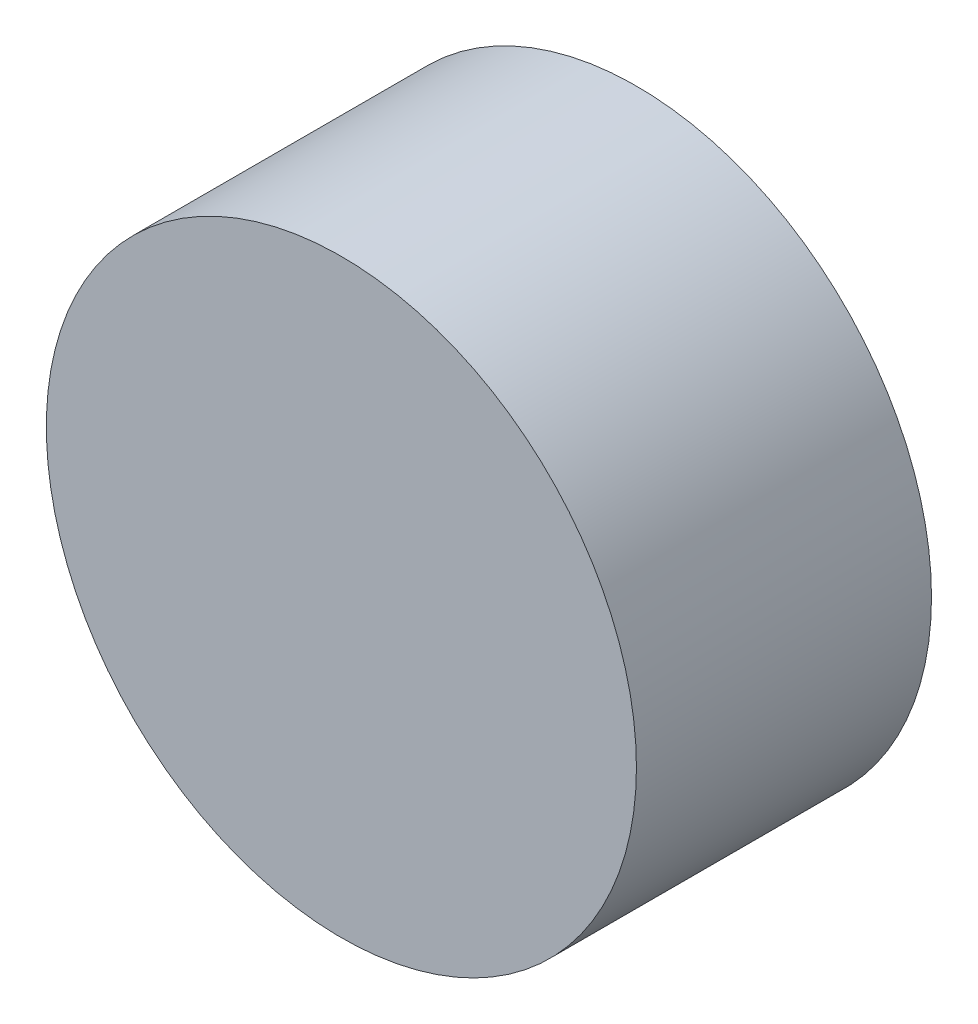
ISO-10303-21;
HEADER;
FILE_DESCRIPTION(('STEP AP214'),'2;1');
FILE_NAME('part.step','',(''),(''),'','','');
FILE_SCHEMA(('AUTOMOTIVE_DESIGN { 1 0 10303 214 1 1 1 1 }'));
ENDSEC;
DATA;
#1=APPLICATION_CONTEXT('core data for automotive mechanical design processes');
#2=APPLICATION_PROTOCOL_DEFINITION('international standard','automotive_design',2000,#1);
#3=PRODUCT_CONTEXT('',#1,'mechanical');
#4=PRODUCT('Part','Part','',(#3));
#5=PRODUCT_RELATED_PRODUCT_CATEGORY('part','',(#4));
#6=PRODUCT_DEFINITION_FORMATION('','',#4);
#7=PRODUCT_DEFINITION_CONTEXT('part definition',#1,'design');
#8=PRODUCT_DEFINITION('design','',#6,#7);
#9=PRODUCT_DEFINITION_SHAPE('','',#8);
#10=(LENGTH_UNIT() NAMED_UNIT(*) SI_UNIT(.MILLI.,.METRE.));
#11=(NAMED_UNIT(*) PLANE_ANGLE_UNIT() SI_UNIT($,.RADIAN.));
#12=(NAMED_UNIT(*) SI_UNIT($,.STERADIAN.) SOLID_ANGLE_UNIT());
#13=UNCERTAINTY_MEASURE_WITH_UNIT(LENGTH_MEASURE(1.E-05),#10,'distance_accuracy_value','');
#14=(GEOMETRIC_REPRESENTATION_CONTEXT(3) GLOBAL_UNCERTAINTY_ASSIGNED_CONTEXT((#13)) GLOBAL_UNIT_ASSIGNED_CONTEXT((#10,
#11,#12)) REPRESENTATION_CONTEXT('',''));
#15=CARTESIAN_POINT('',(0.,0.,0.));
#16=DIRECTION('',(0.,0.,1.));
#17=DIRECTION('',(1.,0.,0.));
#18=AXIS2_PLACEMENT_3D('',#15,#16,#17);
#19=CARTESIAN_POINT('',(0.,0.,5.08));
#20=DIRECTION('',(0.,0.,-1.));
#21=DIRECTION('',(-1.,0.,0.));
#22=AXIS2_PLACEMENT_3D('',#19,#20,#21);
#23=CYLINDRICAL_SURFACE('',#22,5.08);
#24=CARTESIAN_POINT('',(0.,0.,5.08));
#25=DIRECTION('',(0.,0.,1.));
#26=DIRECTION('',(1.,0.,0.));
#27=AXIS2_PLACEMENT_3D('',#24,#25,#26);
#28=CIRCLE('',#27,5.08);
#29=CARTESIAN_POINT('',(5.08,0.,5.08));
#30=VERTEX_POINT('',#29);
#31=EDGE_CURVE('E10',#30,#30,#28,.T.);
#32=ORIENTED_EDGE('',*,*,#31,.F.);
#33=EDGE_LOOP('',(#32));
#34=FACE_BOUND('',#33,.T.);
#35=CARTESIAN_POINT('',(0.,0.,0.));
#36=DIRECTION('',(0.,0.,1.));
#37=DIRECTION('',(1.,0.,0.));
#38=AXIS2_PLACEMENT_3D('',#35,#36,#37);
#39=CIRCLE('',#38,5.08);
#40=CARTESIAN_POINT('',(5.08,0.,0.));
#41=VERTEX_POINT('',#40);
#42=EDGE_CURVE('E34',#41,#41,#39,.T.);
#43=ORIENTED_EDGE('',*,*,#42,.T.);
#44=EDGE_LOOP('',(#43));
#45=FACE_BOUND('',#44,.T.);
#46=ADVANCED_FACE('F31',(#34,#45),#23,.T.);
#47=CARTESIAN_POINT('',(0.,0.,5.08));
#48=DIRECTION('',(0.,0.,1.));
#49=DIRECTION('',(1.,0.,0.));
#50=AXIS2_PLACEMENT_3D('',#47,#48,#49);
#51=PLANE('',#50);
#52=ORIENTED_EDGE('',*,*,#31,.T.);
#53=EDGE_LOOP('',(#52));
#54=FACE_BOUND('',#53,.T.);
#55=ADVANCED_FACE('F46',(#54),#51,.T.);
#56=CARTESIAN_POINT('',(0.,0.,0.));
#57=DIRECTION('',(0.,0.,1.));
#58=DIRECTION('',(1.,0.,0.));
#59=AXIS2_PLACEMENT_3D('',#56,#57,#58);
#60=PLANE('',#59);
#61=ORIENTED_EDGE('',*,*,#42,.F.);
#62=EDGE_LOOP('',(#61));
#63=FACE_BOUND('',#62,.T.);
#64=ADVANCED_FACE('F44',(#63),#60,.F.);
#65=CLOSED_SHELL('',(#46,#55,#64));
#66=MANIFOLD_SOLID_BREP('B2',#65);
#67=ADVANCED_BREP_SHAPE_REPRESENTATION('',(#18,#66),#14);
#68=SHAPE_DEFINITION_REPRESENTATION(#9,#67);
ENDSEC;
END-ISO-10303-21;
